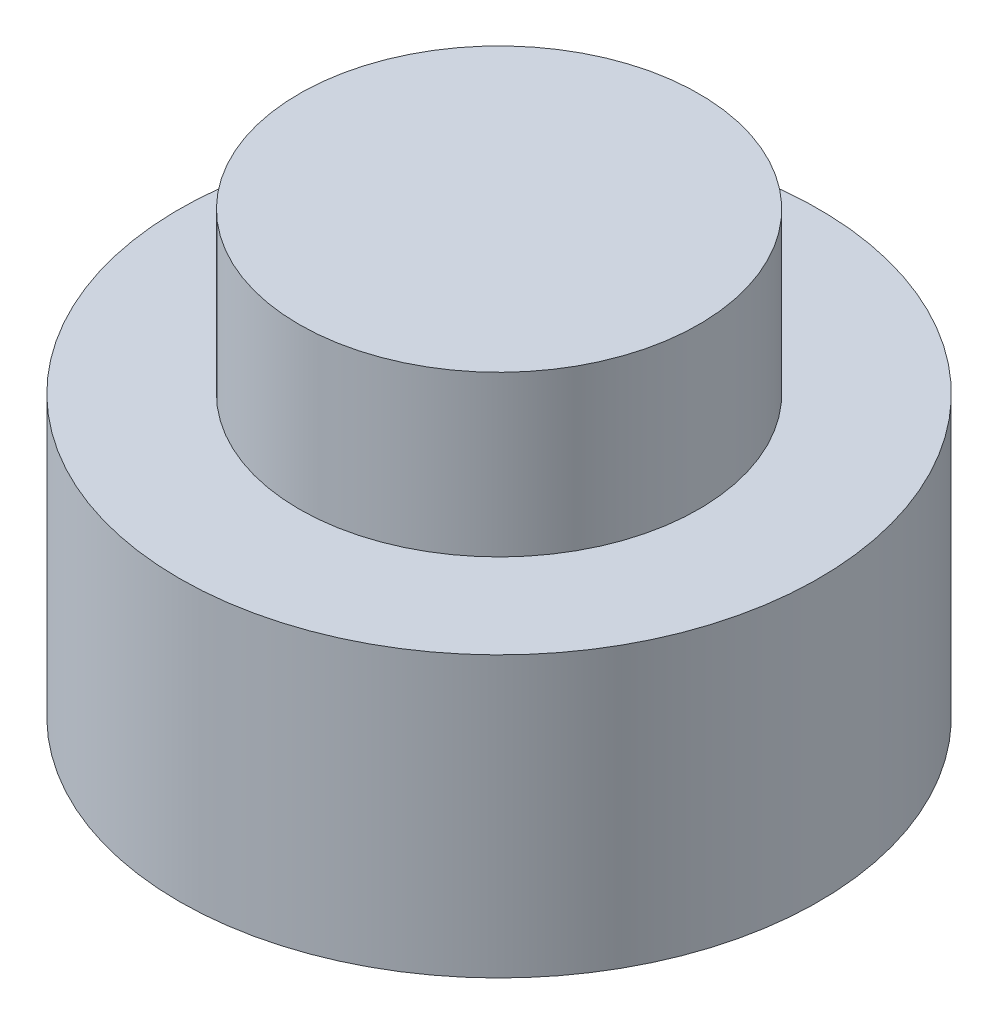
ISO-10303-21;
HEADER;
FILE_DESCRIPTION(('STEP AP214'),'2;1');
FILE_NAME('part.step','',(''),(''),'','','');
FILE_SCHEMA(('AUTOMOTIVE_DESIGN { 1 0 10303 214 1 1 1 1 }'));
ENDSEC;
DATA;
#1=APPLICATION_CONTEXT('core data for automotive mechanical design processes');
#2=APPLICATION_PROTOCOL_DEFINITION('international standard','automotive_design',2000,#1);
#3=PRODUCT_CONTEXT('',#1,'mechanical');
#4=PRODUCT('Part','Part','',(#3));
#5=PRODUCT_RELATED_PRODUCT_CATEGORY('part','',(#4));
#6=PRODUCT_DEFINITION_FORMATION('','',#4);
#7=PRODUCT_DEFINITION_CONTEXT('part definition',#1,'design');
#8=PRODUCT_DEFINITION('design','',#6,#7);
#9=PRODUCT_DEFINITION_SHAPE('','',#8);
#10=(LENGTH_UNIT() NAMED_UNIT(*) SI_UNIT(.MILLI.,.METRE.));
#11=(NAMED_UNIT(*) PLANE_ANGLE_UNIT() SI_UNIT($,.RADIAN.));
#12=(NAMED_UNIT(*) SI_UNIT($,.STERADIAN.) SOLID_ANGLE_UNIT());
#13=UNCERTAINTY_MEASURE_WITH_UNIT(LENGTH_MEASURE(1.E-05),#10,'distance_accuracy_value','');
#14=(GEOMETRIC_REPRESENTATION_CONTEXT(3) GLOBAL_UNCERTAINTY_ASSIGNED_CONTEXT((#13)) GLOBAL_UNIT_ASSIGNED_CONTEXT((#10,
#11,#12)) REPRESENTATION_CONTEXT('',''));
#15=CARTESIAN_POINT('',(0.,0.,0.));
#16=DIRECTION('',(0.,0.,1.));
#17=DIRECTION('',(1.,0.,0.));
#18=AXIS2_PLACEMENT_3D('',#15,#16,#17);
#19=CARTESIAN_POINT('',(0.,7.,0.));
#20=DIRECTION('',(0.,-1.,0.));
#21=DIRECTION('',(0.,0.,-1.));
#22=AXIS2_PLACEMENT_3D('',#19,#20,#21);
#23=CYLINDRICAL_SURFACE('',#22,8.);
#24=CARTESIAN_POINT('',(0.,7.,0.));
#25=DIRECTION('',(0.,1.,0.));
#26=DIRECTION('',(0.,0.,1.));
#27=AXIS2_PLACEMENT_3D('',#24,#25,#26);
#28=CIRCLE('',#27,8.);
#29=CARTESIAN_POINT('',(0.,7.,8.));
#30=VERTEX_POINT('',#29);
#31=EDGE_CURVE('E45',#30,#30,#28,.T.);
#32=ORIENTED_EDGE('',*,*,#31,.F.);
#33=EDGE_LOOP('',(#32));
#34=FACE_BOUND('',#33,.T.);
#35=CARTESIAN_POINT('',(0.,0.,0.));
#36=DIRECTION('',(0.,1.,0.));
#37=DIRECTION('',(0.,0.,1.));
#38=AXIS2_PLACEMENT_3D('',#35,#36,#37);
#39=CIRCLE('',#38,8.);
#40=CARTESIAN_POINT('',(0.,0.,8.));
#41=VERTEX_POINT('',#40);
#42=EDGE_CURVE('E40',#41,#41,#39,.T.);
#43=ORIENTED_EDGE('',*,*,#42,.T.);
#44=EDGE_LOOP('',(#43));
#45=FACE_BOUND('',#44,.T.);
#46=ADVANCED_FACE('F37',(#34,#45),#23,.T.);
#47=CARTESIAN_POINT('',(0.,7.,0.));
#48=DIRECTION('',(0.,1.,0.));
#49=DIRECTION('',(0.,0.,1.));
#50=AXIS2_PLACEMENT_3D('',#47,#48,#49);
#51=PLANE('',#50);
#52=CARTESIAN_POINT('',(0.,7.,0.));
#53=DIRECTION('',(0.,1.,0.));
#54=DIRECTION('',(0.,0.,1.));
#55=AXIS2_PLACEMENT_3D('',#52,#53,#54);
#56=CIRCLE('',#55,5.);
#57=CARTESIAN_POINT('',(0.,7.,5.));
#58=VERTEX_POINT('',#57);
#59=EDGE_CURVE('E10',#58,#58,#56,.T.);
#60=ORIENTED_EDGE('',*,*,#59,.F.);
#61=EDGE_LOOP('',(#60));
#62=FACE_BOUND('',#61,.T.);
#63=ORIENTED_EDGE('',*,*,#31,.T.);
#64=EDGE_LOOP('',(#63));
#65=FACE_BOUND('',#64,.T.);
#66=ADVANCED_FACE('F65',(#62,#65),#51,.T.);
#67=CARTESIAN_POINT('',(0.,0.,0.));
#68=DIRECTION('',(0.,1.,0.));
#69=DIRECTION('',(0.,0.,1.));
#70=AXIS2_PLACEMENT_3D('',#67,#68,#69);
#71=PLANE('',#70);
#72=ORIENTED_EDGE('',*,*,#42,.F.);
#73=EDGE_LOOP('',(#72));
#74=FACE_BOUND('',#73,.T.);
#75=ADVANCED_FACE('F62',(#74),#71,.F.);
#76=CARTESIAN_POINT('',(0.,11.,0.));
#77=DIRECTION('',(0.,-1.,0.));
#78=DIRECTION('',(0.,0.,-1.));
#79=AXIS2_PLACEMENT_3D('',#76,#77,#78);
#80=CYLINDRICAL_SURFACE('',#79,5.);
#81=CARTESIAN_POINT('',(0.,11.,0.));
#82=DIRECTION('',(0.,1.,0.));
#83=DIRECTION('',(0.,0.,1.));
#84=AXIS2_PLACEMENT_3D('',#81,#82,#83);
#85=CIRCLE('',#84,5.);
#86=CARTESIAN_POINT('',(0.,11.,5.));
#87=VERTEX_POINT('',#86);
#88=EDGE_CURVE('E52',#87,#87,#85,.T.);
#89=ORIENTED_EDGE('',*,*,#88,.F.);
#90=EDGE_LOOP('',(#89));
#91=FACE_BOUND('',#90,.T.);
#92=ORIENTED_EDGE('',*,*,#59,.T.);
#93=EDGE_LOOP('',(#92));
#94=FACE_BOUND('',#93,.T.);
#95=ADVANCED_FACE('F64',(#91,#94),#80,.T.);
#96=CARTESIAN_POINT('',(0.,11.,0.));
#97=DIRECTION('',(0.,1.,0.));
#98=DIRECTION('',(0.,0.,1.));
#99=AXIS2_PLACEMENT_3D('',#96,#97,#98);
#100=PLANE('',#99);
#101=ORIENTED_EDGE('',*,*,#88,.T.);
#102=EDGE_LOOP('',(#101));
#103=FACE_BOUND('',#102,.T.);
#104=ADVANCED_FACE('F70',(#103),#100,.T.);
#105=CLOSED_SHELL('',(#46,#66,#75,#95,#104));
#106=MANIFOLD_SOLID_BREP('B2',#105);
#107=ADVANCED_BREP_SHAPE_REPRESENTATION('',(#18,#106),#14);
#108=SHAPE_DEFINITION_REPRESENTATION(#9,#107);
ENDSEC;
END-ISO-10303-21;
